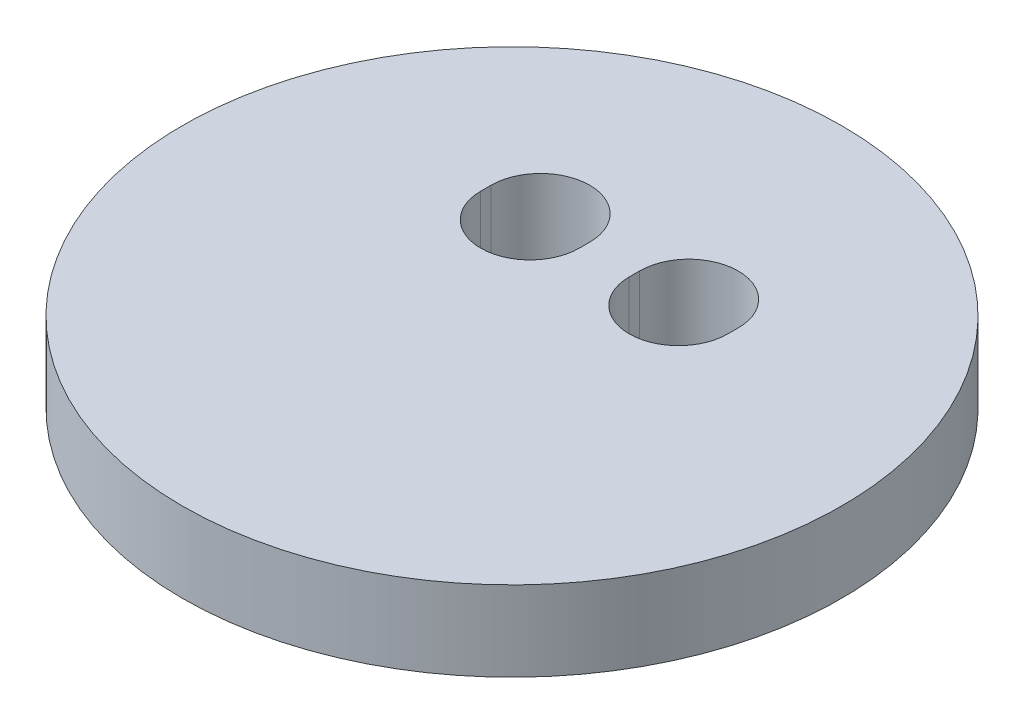
ISO-10303-21;
HEADER;
FILE_DESCRIPTION(('STEP AP214'),'2;1');
FILE_NAME('part.step','',(''),(''),'','','');
FILE_SCHEMA(('AUTOMOTIVE_DESIGN { 1 0 10303 214 1 1 1 1 }'));
ENDSEC;
DATA;
#1=APPLICATION_CONTEXT('core data for automotive mechanical design processes');
#2=APPLICATION_PROTOCOL_DEFINITION('international standard','automotive_design',2000,#1);
#3=PRODUCT_CONTEXT('',#1,'mechanical');
#4=PRODUCT('Part','Part','',(#3));
#5=PRODUCT_RELATED_PRODUCT_CATEGORY('part','',(#4));
#6=PRODUCT_DEFINITION_FORMATION('','',#4);
#7=PRODUCT_DEFINITION_CONTEXT('part definition',#1,'design');
#8=PRODUCT_DEFINITION('design','',#6,#7);
#9=PRODUCT_DEFINITION_SHAPE('','',#8);
#10=(LENGTH_UNIT() NAMED_UNIT(*) SI_UNIT(.MILLI.,.METRE.));
#11=(NAMED_UNIT(*) PLANE_ANGLE_UNIT() SI_UNIT($,.RADIAN.));
#12=(NAMED_UNIT(*) SI_UNIT($,.STERADIAN.) SOLID_ANGLE_UNIT());
#13=UNCERTAINTY_MEASURE_WITH_UNIT(LENGTH_MEASURE(1.E-05),#10,'distance_accuracy_value','');
#14=(GEOMETRIC_REPRESENTATION_CONTEXT(3) GLOBAL_UNCERTAINTY_ASSIGNED_CONTEXT((#13)) GLOBAL_UNIT_ASSIGNED_CONTEXT((#10,
#11,#12)) REPRESENTATION_CONTEXT('',''));
#15=CARTESIAN_POINT('',(0.,0.,0.));
#16=DIRECTION('',(0.,0.,1.));
#17=DIRECTION('',(1.,0.,0.));
#18=AXIS2_PLACEMENT_3D('',#15,#16,#17);
#19=CARTESIAN_POINT('',(0.,3.,0.));
#20=DIRECTION('',(0.,-1.,0.));
#21=DIRECTION('',(0.,0.,-1.));
#22=AXIS2_PLACEMENT_3D('',#19,#20,#21);
#23=CYLINDRICAL_SURFACE('',#22,12.36);
#24=CARTESIAN_POINT('',(0.,3.,0.));
#25=DIRECTION('',(0.,1.,0.));
#26=DIRECTION('',(0.,0.,1.));
#27=AXIS2_PLACEMENT_3D('',#24,#25,#26);
#28=CIRCLE('',#27,12.36);
#29=CARTESIAN_POINT('',(0.,3.,12.36));
#30=VERTEX_POINT('',#29);
#31=EDGE_CURVE('E11',#30,#30,#28,.T.);
#32=ORIENTED_EDGE('',*,*,#31,.F.);
#33=EDGE_LOOP('',(#32));
#34=FACE_BOUND('',#33,.T.);
#35=CARTESIAN_POINT('',(0.,0.,0.));
#36=DIRECTION('',(0.,1.,0.));
#37=DIRECTION('',(0.,0.,1.));
#38=AXIS2_PLACEMENT_3D('',#35,#36,#37);
#39=CIRCLE('',#38,12.36);
#40=CARTESIAN_POINT('',(0.,0.,12.36));
#41=VERTEX_POINT('',#40);
#42=EDGE_CURVE('E46',#41,#41,#39,.T.);
#43=ORIENTED_EDGE('',*,*,#42,.T.);
#44=EDGE_LOOP('',(#43));
#45=FACE_BOUND('',#44,.T.);
#46=ADVANCED_FACE('F43',(#34,#45),#23,.T.);
#47=CARTESIAN_POINT('',(0.,3.,0.));
#48=DIRECTION('',(0.,1.,0.));
#49=DIRECTION('',(0.,0.,1.));
#50=AXIS2_PLACEMENT_3D('',#47,#48,#49);
#51=PLANE('',#50);
#52=CARTESIAN_POINT('',(-2.785,3.,-3.85));
#53=DIRECTION('',(0.,1.,0.));
#54=DIRECTION('',(0.,0.,1.));
#55=AXIS2_PLACEMENT_3D('',#52,#53,#54);
#56=CIRCLE('',#55,1.85);
#57=CARTESIAN_POINT('',(-0.935000000000001,3.,-3.85));
#58=VERTEX_POINT('',#57);
#59=CARTESIAN_POINT('',(-4.635,3.,-3.85));
#60=VERTEX_POINT('',#59);
#61=EDGE_CURVE('E58',#58,#60,#56,.T.);
#62=ORIENTED_EDGE('',*,*,#61,.F.);
#63=DIRECTION('',(0.,0.,-1.));
#64=VECTOR('',#63,1.);
#65=CARTESIAN_POINT('',(-0.935000000000001,3.,-3.85));
#66=LINE('',#65,#64);
#67=CARTESIAN_POINT('',(-0.935000000000001,3.,-3.46000000000001));
#68=VERTEX_POINT('',#67);
#69=EDGE_CURVE('E132',#68,#58,#66,.T.);
#70=ORIENTED_EDGE('',*,*,#69,.F.);
#71=CARTESIAN_POINT('',(-2.785,3.,-3.46));
#72=DIRECTION('',(0.,1.,0.));
#73=DIRECTION('',(0.,0.,1.));
#74=AXIS2_PLACEMENT_3D('',#71,#72,#73);
#75=CIRCLE('',#74,1.85);
#76=CARTESIAN_POINT('',(-4.635,3.,-3.46));
#77=VERTEX_POINT('',#76);
#78=EDGE_CURVE('E136',#77,#68,#75,.T.);
#79=ORIENTED_EDGE('',*,*,#78,.F.);
#80=DIRECTION('',(0.,0.,1.));
#81=VECTOR('',#80,1.);
#82=CARTESIAN_POINT('',(-4.635,3.,-3.85));
#83=LINE('',#82,#81);
#84=EDGE_CURVE('E145',#60,#77,#83,.T.);
#85=ORIENTED_EDGE('',*,*,#84,.F.);
#86=EDGE_LOOP('',(#62,#70,#79,#85));
#87=FACE_BOUND('',#86,.T.);
#88=CARTESIAN_POINT('',(2.785,3.,-3.85));
#89=DIRECTION('',(0.,1.,0.));
#90=DIRECTION('',(0.,0.,1.));
#91=AXIS2_PLACEMENT_3D('',#88,#89,#90);
#92=CIRCLE('',#91,1.85);
#93=CARTESIAN_POINT('',(4.635,3.,-3.85));
#94=VERTEX_POINT('',#93);
#95=CARTESIAN_POINT('',(0.934999999999997,3.,-3.85));
#96=VERTEX_POINT('',#95);
#97=EDGE_CURVE('E66',#94,#96,#92,.T.);
#98=ORIENTED_EDGE('',*,*,#97,.F.);
#99=DIRECTION('',(0.,0.,-1.));
#100=VECTOR('',#99,1.);
#101=CARTESIAN_POINT('',(4.635,3.,-3.85));
#102=LINE('',#101,#100);
#103=CARTESIAN_POINT('',(4.635,3.,-3.46));
#104=VERTEX_POINT('',#103);
#105=EDGE_CURVE('E172',#104,#94,#102,.T.);
#106=ORIENTED_EDGE('',*,*,#105,.F.);
#107=CARTESIAN_POINT('',(2.785,3.,-3.46));
#108=DIRECTION('',(0.,1.,0.));
#109=DIRECTION('',(0.,0.,1.));
#110=AXIS2_PLACEMENT_3D('',#107,#108,#109);
#111=CIRCLE('',#110,1.85);
#112=CARTESIAN_POINT('',(0.934999999999996,3.,-3.46));
#113=VERTEX_POINT('',#112);
#114=EDGE_CURVE('E176',#113,#104,#111,.T.);
#115=ORIENTED_EDGE('',*,*,#114,.F.);
#116=DIRECTION('',(0.,0.,1.));
#117=VECTOR('',#116,1.);
#118=CARTESIAN_POINT('',(0.934999999999997,3.,-3.85));
#119=LINE('',#118,#117);
#120=EDGE_CURVE('E181',#96,#113,#119,.T.);
#121=ORIENTED_EDGE('',*,*,#120,.F.);
#122=EDGE_LOOP('',(#98,#106,#115,#121));
#123=FACE_BOUND('',#122,.T.);
#124=ORIENTED_EDGE('',*,*,#31,.T.);
#125=EDGE_LOOP('',(#124));
#126=FACE_BOUND('',#125,.T.);
#127=ADVANCED_FACE('F216',(#87,#123,#126),#51,.T.);
#128=CARTESIAN_POINT('',(0.,0.,0.));
#129=DIRECTION('',(0.,1.,0.));
#130=DIRECTION('',(0.,0.,1.));
#131=AXIS2_PLACEMENT_3D('',#128,#129,#130);
#132=PLANE('',#131);
#133=DIRECTION('',(0.,0.,-1.));
#134=VECTOR('',#133,1.);
#135=CARTESIAN_POINT('',(-0.935000000000001,0.,-3.85));
#136=LINE('',#135,#134);
#137=CARTESIAN_POINT('',(-0.935000000000001,0.,-3.46000000000001));
#138=VERTEX_POINT('',#137);
#139=CARTESIAN_POINT('',(-0.935000000000001,0.,-3.85));
#140=VERTEX_POINT('',#139);
#141=EDGE_CURVE('E117',#138,#140,#136,.T.);
#142=ORIENTED_EDGE('',*,*,#141,.T.);
#143=CARTESIAN_POINT('',(-2.785,0.,-3.85));
#144=DIRECTION('',(0.,1.,0.));
#145=DIRECTION('',(0.,0.,1.));
#146=AXIS2_PLACEMENT_3D('',#143,#144,#145);
#147=CIRCLE('',#146,1.85);
#148=CARTESIAN_POINT('',(-4.635,0.,-3.85));
#149=VERTEX_POINT('',#148);
#150=EDGE_CURVE('E110',#140,#149,#147,.T.);
#151=ORIENTED_EDGE('',*,*,#150,.T.);
#152=DIRECTION('',(0.,0.,1.));
#153=VECTOR('',#152,1.);
#154=CARTESIAN_POINT('',(-4.635,0.,-3.85));
#155=LINE('',#154,#153);
#156=CARTESIAN_POINT('',(-4.635,0.,-3.46));
#157=VERTEX_POINT('',#156);
#158=EDGE_CURVE('E121',#149,#157,#155,.T.);
#159=ORIENTED_EDGE('',*,*,#158,.T.);
#160=CARTESIAN_POINT('',(-2.785,0.,-3.46));
#161=DIRECTION('',(0.,1.,0.));
#162=DIRECTION('',(0.,0.,1.));
#163=AXIS2_PLACEMENT_3D('',#160,#161,#162);
#164=CIRCLE('',#163,1.85);
#165=EDGE_CURVE('E126',#157,#138,#164,.T.);
#166=ORIENTED_EDGE('',*,*,#165,.T.);
#167=EDGE_LOOP('',(#142,#151,#159,#166));
#168=FACE_BOUND('',#167,.T.);
#169=DIRECTION('',(0.,0.,-1.));
#170=VECTOR('',#169,1.);
#171=CARTESIAN_POINT('',(4.635,0.,-3.85));
#172=LINE('',#171,#170);
#173=CARTESIAN_POINT('',(4.635,0.,-3.46));
#174=VERTEX_POINT('',#173);
#175=CARTESIAN_POINT('',(4.635,0.,-3.85));
#176=VERTEX_POINT('',#175);
#177=EDGE_CURVE('E162',#174,#176,#172,.T.);
#178=ORIENTED_EDGE('',*,*,#177,.T.);
#179=CARTESIAN_POINT('',(2.785,0.,-3.85));
#180=DIRECTION('',(0.,1.,0.));
#181=DIRECTION('',(0.,0.,1.));
#182=AXIS2_PLACEMENT_3D('',#179,#180,#181);
#183=CIRCLE('',#182,1.85);
#184=CARTESIAN_POINT('',(0.934999999999997,0.,-3.85));
#185=VERTEX_POINT('',#184);
#186=EDGE_CURVE('E177',#176,#185,#183,.T.);
#187=ORIENTED_EDGE('',*,*,#186,.T.);
#188=DIRECTION('',(0.,0.,1.));
#189=VECTOR('',#188,1.);
#190=CARTESIAN_POINT('',(0.934999999999997,0.,-3.85));
#191=LINE('',#190,#189);
#192=CARTESIAN_POINT('',(0.934999999999997,0.,-3.46));
#193=VERTEX_POINT('',#192);
#194=EDGE_CURVE('E194',#185,#193,#191,.T.);
#195=ORIENTED_EDGE('',*,*,#194,.T.);
#196=CARTESIAN_POINT('',(2.785,0.,-3.46));
#197=DIRECTION('',(0.,1.,0.));
#198=DIRECTION('',(0.,0.,1.));
#199=AXIS2_PLACEMENT_3D('',#196,#197,#198);
#200=CIRCLE('',#199,1.85);
#201=EDGE_CURVE('E190',#193,#174,#200,.T.);
#202=ORIENTED_EDGE('',*,*,#201,.T.);
#203=EDGE_LOOP('',(#178,#187,#195,#202));
#204=FACE_BOUND('',#203,.T.);
#205=ORIENTED_EDGE('',*,*,#42,.F.);
#206=EDGE_LOOP('',(#205));
#207=FACE_BOUND('',#206,.T.);
#208=ADVANCED_FACE('F128',(#168,#204,#207),#132,.F.);
#209=CARTESIAN_POINT('',(2.785,0.,-3.85));
#210=DIRECTION('',(0.,1.,0.));
#211=DIRECTION('',(0.,0.,1.));
#212=AXIS2_PLACEMENT_3D('',#209,#210,#211);
#213=CYLINDRICAL_SURFACE('',#212,1.85);
#214=ORIENTED_EDGE('',*,*,#97,.T.);
#215=DIRECTION('',(0.,1.,0.));
#216=VECTOR('',#215,1.);
#217=CARTESIAN_POINT('',(0.934999999999997,0.,-3.85));
#218=LINE('',#217,#216);
#219=EDGE_CURVE('E159',#185,#96,#218,.T.);
#220=ORIENTED_EDGE('',*,*,#219,.F.);
#221=ORIENTED_EDGE('',*,*,#186,.F.);
#222=DIRECTION('',(0.,1.,0.));
#223=VECTOR('',#222,1.);
#224=CARTESIAN_POINT('',(4.635,0.,-3.85));
#225=LINE('',#224,#223);
#226=EDGE_CURVE('E169',#176,#94,#225,.T.);
#227=ORIENTED_EDGE('',*,*,#226,.T.);
#228=EDGE_LOOP('',(#214,#220,#221,#227));
#229=FACE_BOUND('',#228,.T.);
#230=ADVANCED_FACE('F204',(#229),#213,.F.);
#231=CARTESIAN_POINT('',(4.635,0.,-3.85));
#232=DIRECTION('',(1.,0.,0.));
#233=DIRECTION('',(0.,0.,-1.));
#234=AXIS2_PLACEMENT_3D('',#231,#232,#233);
#235=PLANE('',#234);
#236=ORIENTED_EDGE('',*,*,#105,.T.);
#237=ORIENTED_EDGE('',*,*,#226,.F.);
#238=ORIENTED_EDGE('',*,*,#177,.F.);
#239=DIRECTION('',(0.,1.,0.));
#240=VECTOR('',#239,1.);
#241=CARTESIAN_POINT('',(4.635,0.,-3.46));
#242=LINE('',#241,#240);
#243=EDGE_CURVE('E166',#174,#104,#242,.T.);
#244=ORIENTED_EDGE('',*,*,#243,.T.);
#245=EDGE_LOOP('',(#236,#237,#238,#244));
#246=FACE_BOUND('',#245,.T.);
#247=ADVANCED_FACE('F214',(#246),#235,.F.);
#248=CARTESIAN_POINT('',(2.785,0.,-3.46));
#249=DIRECTION('',(0.,1.,0.));
#250=DIRECTION('',(0.,0.,1.));
#251=AXIS2_PLACEMENT_3D('',#248,#249,#250);
#252=CYLINDRICAL_SURFACE('',#251,1.85);
#253=ORIENTED_EDGE('',*,*,#114,.T.);
#254=ORIENTED_EDGE('',*,*,#243,.F.);
#255=ORIENTED_EDGE('',*,*,#201,.F.);
#256=DIRECTION('',(0.,1.,0.));
#257=VECTOR('',#256,1.);
#258=CARTESIAN_POINT('',(0.934999999999996,0.,-3.46));
#259=LINE('',#258,#257);
#260=EDGE_CURVE('E163',#193,#113,#259,.T.);
#261=ORIENTED_EDGE('',*,*,#260,.T.);
#262=EDGE_LOOP('',(#253,#254,#255,#261));
#263=FACE_BOUND('',#262,.T.);
#264=ADVANCED_FACE('F211',(#263),#252,.F.);
#265=CARTESIAN_POINT('',(0.934999999999997,0.,-3.85));
#266=DIRECTION('',(-1.,0.,0.));
#267=DIRECTION('',(0.,0.,1.));
#268=AXIS2_PLACEMENT_3D('',#265,#266,#267);
#269=PLANE('',#268);
#270=ORIENTED_EDGE('',*,*,#120,.T.);
#271=ORIENTED_EDGE('',*,*,#260,.F.);
#272=ORIENTED_EDGE('',*,*,#194,.F.);
#273=ORIENTED_EDGE('',*,*,#219,.T.);
#274=EDGE_LOOP('',(#270,#271,#272,#273));
#275=FACE_BOUND('',#274,.T.);
#276=ADVANCED_FACE('F208',(#275),#269,.F.);
#277=CARTESIAN_POINT('',(-2.785,0.,-3.85));
#278=DIRECTION('',(0.,1.,0.));
#279=DIRECTION('',(0.,0.,1.));
#280=AXIS2_PLACEMENT_3D('',#277,#278,#279);
#281=CYLINDRICAL_SURFACE('',#280,1.85);
#282=ORIENTED_EDGE('',*,*,#61,.T.);
#283=DIRECTION('',(0.,1.,0.));
#284=VECTOR('',#283,1.);
#285=CARTESIAN_POINT('',(-4.635,0.,-3.85));
#286=LINE('',#285,#284);
#287=EDGE_CURVE('E106',#149,#60,#286,.T.);
#288=ORIENTED_EDGE('',*,*,#287,.F.);
#289=ORIENTED_EDGE('',*,*,#150,.F.);
#290=DIRECTION('',(0.,1.,0.));
#291=VECTOR('',#290,1.);
#292=CARTESIAN_POINT('',(-0.935000000000001,0.,-3.85));
#293=LINE('',#292,#291);
#294=EDGE_CURVE('E151',#140,#58,#293,.T.);
#295=ORIENTED_EDGE('',*,*,#294,.T.);
#296=EDGE_LOOP('',(#282,#288,#289,#295));
#297=FACE_BOUND('',#296,.T.);
#298=ADVANCED_FACE('F108',(#297),#281,.F.);
#299=CARTESIAN_POINT('',(-0.935000000000001,0.,-3.85));
#300=DIRECTION('',(1.,0.,0.));
#301=DIRECTION('',(0.,0.,-1.));
#302=AXIS2_PLACEMENT_3D('',#299,#300,#301);
#303=PLANE('',#302);
#304=ORIENTED_EDGE('',*,*,#69,.T.);
#305=ORIENTED_EDGE('',*,*,#294,.F.);
#306=ORIENTED_EDGE('',*,*,#141,.F.);
#307=DIRECTION('',(0.,1.,0.));
#308=VECTOR('',#307,1.);
#309=CARTESIAN_POINT('',(-0.935000000000001,0.,-3.46000000000001));
#310=LINE('',#309,#308);
#311=EDGE_CURVE('E154',#138,#68,#310,.T.);
#312=ORIENTED_EDGE('',*,*,#311,.T.);
#313=EDGE_LOOP('',(#304,#305,#306,#312));
#314=FACE_BOUND('',#313,.T.);
#315=ADVANCED_FACE('F242',(#314),#303,.F.);
#316=CARTESIAN_POINT('',(-2.785,0.,-3.46));
#317=DIRECTION('',(0.,1.,0.));
#318=DIRECTION('',(0.,0.,1.));
#319=AXIS2_PLACEMENT_3D('',#316,#317,#318);
#320=CYLINDRICAL_SURFACE('',#319,1.85);
#321=ORIENTED_EDGE('',*,*,#78,.T.);
#322=ORIENTED_EDGE('',*,*,#311,.F.);
#323=ORIENTED_EDGE('',*,*,#165,.F.);
#324=DIRECTION('',(0.,1.,0.));
#325=VECTOR('',#324,1.);
#326=CARTESIAN_POINT('',(-4.635,0.,-3.46));
#327=LINE('',#326,#325);
#328=EDGE_CURVE('E116',#157,#77,#327,.T.);
#329=ORIENTED_EDGE('',*,*,#328,.T.);
#330=EDGE_LOOP('',(#321,#322,#323,#329));
#331=FACE_BOUND('',#330,.T.);
#332=ADVANCED_FACE('F245',(#331),#320,.F.);
#333=CARTESIAN_POINT('',(-4.635,0.,-3.85));
#334=DIRECTION('',(-1.,0.,0.));
#335=DIRECTION('',(0.,0.,1.));
#336=AXIS2_PLACEMENT_3D('',#333,#334,#335);
#337=PLANE('',#336);
#338=ORIENTED_EDGE('',*,*,#84,.T.);
#339=ORIENTED_EDGE('',*,*,#328,.F.);
#340=ORIENTED_EDGE('',*,*,#158,.F.);
#341=ORIENTED_EDGE('',*,*,#287,.T.);
#342=EDGE_LOOP('',(#338,#339,#340,#341));
#343=FACE_BOUND('',#342,.T.);
#344=ADVANCED_FACE('F122',(#343),#337,.F.);
#345=CLOSED_SHELL('',(#46,#127,#208,#230,#247,#264,#276,#298,#315,#332,#344));
#346=MANIFOLD_SOLID_BREP('B2',#345);
#347=ADVANCED_BREP_SHAPE_REPRESENTATION('',(#18,#346),#14);
#348=SHAPE_DEFINITION_REPRESENTATION(#9,#347);
ENDSEC;
END-ISO-10303-21;
